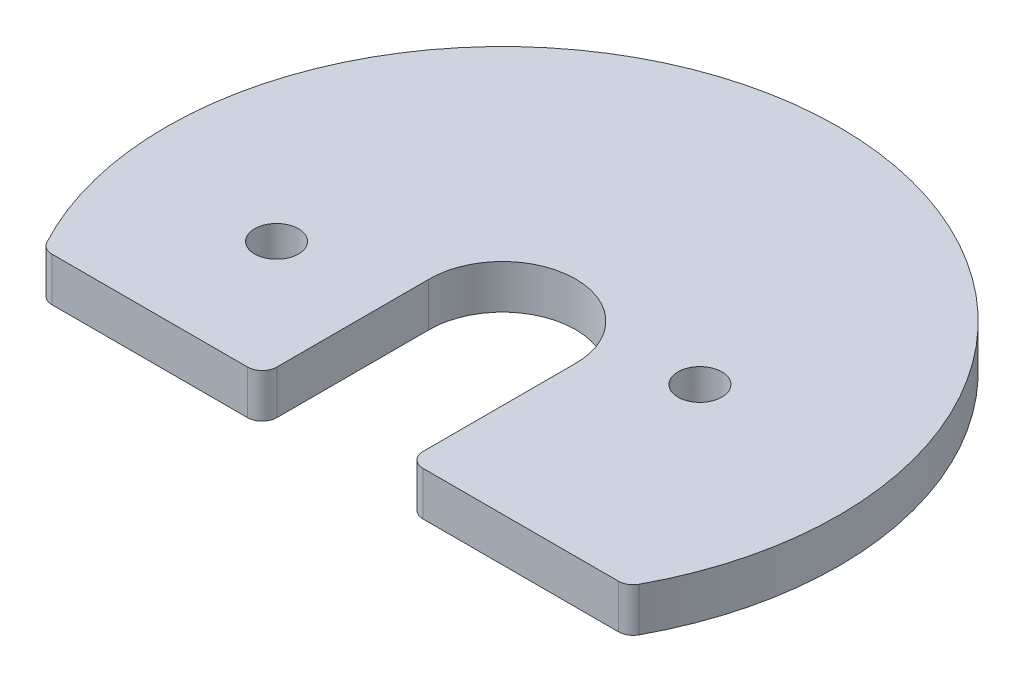
ISO-10303-21;
HEADER;
FILE_DESCRIPTION(('STEP AP214'),'2;1');
FILE_NAME('part.step','',(''),(''),'','','');
FILE_SCHEMA(('AUTOMOTIVE_DESIGN { 1 0 10303 214 1 1 1 1 }'));
ENDSEC;
DATA;
#1=APPLICATION_CONTEXT('core data for automotive mechanical design processes');
#2=APPLICATION_PROTOCOL_DEFINITION('international standard','automotive_design',2000,#1);
#3=PRODUCT_CONTEXT('',#1,'mechanical');
#4=PRODUCT('Part','Part','',(#3));
#5=PRODUCT_RELATED_PRODUCT_CATEGORY('part','',(#4));
#6=PRODUCT_DEFINITION_FORMATION('','',#4);
#7=PRODUCT_DEFINITION_CONTEXT('part definition',#1,'design');
#8=PRODUCT_DEFINITION('design','',#6,#7);
#9=PRODUCT_DEFINITION_SHAPE('','',#8);
#10=(LENGTH_UNIT() NAMED_UNIT(*) SI_UNIT(.MILLI.,.METRE.));
#11=(NAMED_UNIT(*) PLANE_ANGLE_UNIT() SI_UNIT($,.RADIAN.));
#12=(NAMED_UNIT(*) SI_UNIT($,.STERADIAN.) SOLID_ANGLE_UNIT());
#13=UNCERTAINTY_MEASURE_WITH_UNIT(LENGTH_MEASURE(1.E-05),#10,'distance_accuracy_value','');
#14=(GEOMETRIC_REPRESENTATION_CONTEXT(3) GLOBAL_UNCERTAINTY_ASSIGNED_CONTEXT((#13)) GLOBAL_UNIT_ASSIGNED_CONTEXT((#10,
#11,#12)) REPRESENTATION_CONTEXT('',''));
#15=CARTESIAN_POINT('',(0.,0.,0.));
#16=DIRECTION('',(0.,0.,1.));
#17=DIRECTION('',(1.,0.,0.));
#18=AXIS2_PLACEMENT_3D('',#15,#16,#17);
#19=CARTESIAN_POINT('',(0.,3.,0.));
#20=DIRECTION('',(0.,-1.,0.));
#21=DIRECTION('',(0.,0.,-1.));
#22=AXIS2_PLACEMENT_3D('',#19,#20,#21);
#23=CYLINDRICAL_SURFACE('',#22,23.);
#24=CARTESIAN_POINT('',(0.,3.,0.));
#25=DIRECTION('',(0.,1.,0.));
#26=DIRECTION('',(0.,0.,1.));
#27=AXIS2_PLACEMENT_3D('',#24,#25,#26);
#28=CIRCLE('',#27,23.);
#29=CARTESIAN_POINT('',(20.2495448022672,3.,10.906692225463));
#30=VERTEX_POINT('',#29);
#31=CARTESIAN_POINT('',(-20.2495448022671,3.,10.906692225463));
#32=VERTEX_POINT('',#31);
#33=EDGE_CURVE('E134',#30,#32,#28,.T.);
#34=ORIENTED_EDGE('',*,*,#33,.F.);
#35=DIRECTION('',(0.,-1.,0.));
#36=VECTOR('',#35,1.);
#37=CARTESIAN_POINT('',(20.2495448022672,3.,10.906692225463));
#38=LINE('',#37,#36);
#39=CARTESIAN_POINT('',(20.2495448022672,0.,10.906692225463));
#40=VERTEX_POINT('',#39);
#41=EDGE_CURVE('E195',#30,#40,#38,.T.);
#42=ORIENTED_EDGE('',*,*,#41,.T.);
#43=CARTESIAN_POINT('',(0.,0.,0.));
#44=DIRECTION('',(0.,1.,0.));
#45=DIRECTION('',(0.,0.,1.));
#46=AXIS2_PLACEMENT_3D('',#43,#44,#45);
#47=CIRCLE('',#46,23.);
#48=CARTESIAN_POINT('',(-20.2495448022671,0.,10.906692225463));
#49=VERTEX_POINT('',#48);
#50=EDGE_CURVE('E174',#40,#49,#47,.T.);
#51=ORIENTED_EDGE('',*,*,#50,.T.);
#52=DIRECTION('',(0.,-1.,0.));
#53=VECTOR('',#52,1.);
#54=CARTESIAN_POINT('',(-20.2495448022672,3.,10.906692225463));
#55=LINE('',#54,#53);
#56=EDGE_CURVE('E191',#49,#32,#55,.F.);
#57=ORIENTED_EDGE('',*,*,#56,.T.);
#58=EDGE_LOOP('',(#34,#42,#51,#57));
#59=FACE_BOUND('',#58,.T.);
#60=ADVANCED_FACE('F36',(#59),#23,.T.);
#61=CARTESIAN_POINT('',(0.,3.,0.));
#62=DIRECTION('',(0.,1.,0.));
#63=DIRECTION('',(0.,0.,1.));
#64=AXIS2_PLACEMENT_3D('',#61,#62,#63);
#65=PLANE('',#64);
#66=DIRECTION('',(-1.,0.,0.));
#67=VECTOR('',#66,1.);
#68=CARTESIAN_POINT('',(4.99954210615902,3.,11.4324882156603));
#69=LINE('',#68,#67);
#70=CARTESIAN_POINT('',(19.3691298108642,3.,11.4324882156603));
#71=VERTEX_POINT('',#70);
#72=CARTESIAN_POINT('',(5.99954210615902,3.,11.4324882156603));
#73=VERTEX_POINT('',#72);
#74=EDGE_CURVE('E145',#71,#73,#69,.T.);
#75=ORIENTED_EDGE('',*,*,#74,.F.);
#76=CARTESIAN_POINT('',(19.3691298108642,3.,10.4324882156603));
#77=DIRECTION('',(0.,1.,0.));
#78=DIRECTION('',(0.,0.,1.));
#79=AXIS2_PLACEMENT_3D('',#76,#77,#78);
#80=CIRCLE('',#79,1.);
#81=EDGE_CURVE('E223',#71,#30,#80,.T.);
#82=ORIENTED_EDGE('',*,*,#81,.T.);
#83=ORIENTED_EDGE('',*,*,#33,.T.);
#84=CARTESIAN_POINT('',(-19.3691298108642,3.,10.4324882156603));
#85=DIRECTION('',(0.,1.,0.));
#86=DIRECTION('',(0.,0.,1.));
#87=AXIS2_PLACEMENT_3D('',#84,#85,#86);
#88=CIRCLE('',#87,1.);
#89=CARTESIAN_POINT('',(-19.3691298108642,3.,11.4324882156603));
#90=VERTEX_POINT('',#89);
#91=EDGE_CURVE('E58',#32,#90,#88,.T.);
#92=ORIENTED_EDGE('',*,*,#91,.T.);
#93=DIRECTION('',(-1.,0.,0.));
#94=VECTOR('',#93,1.);
#95=CARTESIAN_POINT('',(-4.99954210615902,3.,11.4324882156603));
#96=LINE('',#95,#94);
#97=CARTESIAN_POINT('',(-5.99954210615902,3.,11.4324882156603));
#98=VERTEX_POINT('',#97);
#99=EDGE_CURVE('E140',#98,#90,#96,.T.);
#100=ORIENTED_EDGE('',*,*,#99,.F.);
#101=CARTESIAN_POINT('',(-5.99954210615902,3.,10.4324882156603));
#102=DIRECTION('',(0.,1.,0.));
#103=DIRECTION('',(0.,0.,1.));
#104=AXIS2_PLACEMENT_3D('',#101,#102,#103);
#105=CIRCLE('',#104,1.);
#106=CARTESIAN_POINT('',(-4.99954210615902,3.,10.4324882156603));
#107=VERTEX_POINT('',#106);
#108=EDGE_CURVE('E52',#98,#107,#105,.T.);
#109=ORIENTED_EDGE('',*,*,#108,.T.);
#110=DIRECTION('',(0.,0.,1.));
#111=VECTOR('',#110,1.);
#112=CARTESIAN_POINT('',(-4.99954210615902,3.,11.4324882156603));
#113=LINE('',#112,#111);
#114=CARTESIAN_POINT('',(-4.99954210615903,3.,0.0676663043394062));
#115=VERTEX_POINT('',#114);
#116=EDGE_CURVE('E129',#115,#107,#113,.T.);
#117=ORIENTED_EDGE('',*,*,#116,.F.);
#118=CARTESIAN_POINT('',(0.,3.,0.));
#119=DIRECTION('',(0.,1.,0.));
#120=DIRECTION('',(0.,0.,1.));
#121=AXIS2_PLACEMENT_3D('',#118,#119,#120);
#122=CIRCLE('',#121,5.);
#123=CARTESIAN_POINT('',(4.99954210615902,3.,0.0676663043396541));
#124=VERTEX_POINT('',#123);
#125=EDGE_CURVE('E114',#124,#115,#122,.T.);
#126=ORIENTED_EDGE('',*,*,#125,.F.);
#127=DIRECTION('',(0.,0.,-1.));
#128=VECTOR('',#127,1.);
#129=CARTESIAN_POINT('',(4.99954210615902,3.,11.4324882156603));
#130=LINE('',#129,#128);
#131=CARTESIAN_POINT('',(4.99954210615902,3.,10.4324882156603));
#132=VERTEX_POINT('',#131);
#133=EDGE_CURVE('E151',#132,#124,#130,.T.);
#134=ORIENTED_EDGE('',*,*,#133,.F.);
#135=CARTESIAN_POINT('',(5.99954210615902,3.,10.4324882156603));
#136=DIRECTION('',(0.,1.,0.));
#137=DIRECTION('',(0.,0.,1.));
#138=AXIS2_PLACEMENT_3D('',#135,#136,#137);
#139=CIRCLE('',#138,1.);
#140=EDGE_CURVE('E219',#132,#73,#139,.T.);
#141=ORIENTED_EDGE('',*,*,#140,.T.);
#142=EDGE_LOOP('',(#75,#82,#83,#92,#100,#109,#117,#126,#134,#141));
#143=FACE_BOUND('',#142,.T.);
#144=CARTESIAN_POINT('',(-12.4500000000001,3.,3.00000000000022));
#145=DIRECTION('',(0.,1.,0.));
#146=DIRECTION('',(0.,0.,1.));
#147=AXIS2_PLACEMENT_3D('',#144,#145,#146);
#148=CIRCLE('',#147,1.50000000000002);
#149=CARTESIAN_POINT('',(-12.4500000000001,3.,4.50000000000024));
#150=VERTEX_POINT('',#149);
#151=EDGE_CURVE('E170',#150,#150,#148,.T.);
#152=ORIENTED_EDGE('',*,*,#151,.F.);
#153=EDGE_LOOP('',(#152));
#154=FACE_BOUND('',#153,.T.);
#155=CARTESIAN_POINT('',(10.5000000000072,3.,-2.99999999999923));
#156=DIRECTION('',(0.,1.,0.));
#157=DIRECTION('',(0.,0.,1.));
#158=AXIS2_PLACEMENT_3D('',#155,#156,#157);
#159=CIRCLE('',#158,1.50000000000013);
#160=CARTESIAN_POINT('',(10.5000000000072,3.,-1.4999999999991));
#161=VERTEX_POINT('',#160);
#162=EDGE_CURVE('E162',#161,#161,#159,.T.);
#163=ORIENTED_EDGE('',*,*,#162,.F.);
#164=EDGE_LOOP('',(#163));
#165=FACE_BOUND('',#164,.T.);
#166=ADVANCED_FACE('F137',(#143,#154,#165),#65,.T.);
#167=CARTESIAN_POINT('',(0.,0.,0.));
#168=DIRECTION('',(0.,1.,0.));
#169=DIRECTION('',(0.,0.,1.));
#170=AXIS2_PLACEMENT_3D('',#167,#168,#169);
#171=PLANE('',#170);
#172=ORIENTED_EDGE('',*,*,#50,.F.);
#173=CARTESIAN_POINT('',(19.3691298108642,0.,10.4324882156603));
#174=DIRECTION('',(0.,1.,0.));
#175=DIRECTION('',(0.,0.,1.));
#176=AXIS2_PLACEMENT_3D('',#173,#174,#175);
#177=CIRCLE('',#176,1.);
#178=CARTESIAN_POINT('',(19.3691298108642,0.,11.4324882156603));
#179=VERTEX_POINT('',#178);
#180=EDGE_CURVE('E208',#40,#179,#177,.F.);
#181=ORIENTED_EDGE('',*,*,#180,.T.);
#182=DIRECTION('',(-1.,0.,0.));
#183=VECTOR('',#182,1.);
#184=CARTESIAN_POINT('',(0.,0.,11.4324882156603));
#185=LINE('',#184,#183);
#186=CARTESIAN_POINT('',(5.99954210615902,0.,11.4324882156603));
#187=VERTEX_POINT('',#186);
#188=EDGE_CURVE('E187',#179,#187,#185,.T.);
#189=ORIENTED_EDGE('',*,*,#188,.T.);
#190=CARTESIAN_POINT('',(5.99954210615902,0.,10.4324882156603));
#191=DIRECTION('',(0.,1.,0.));
#192=DIRECTION('',(0.,0.,1.));
#193=AXIS2_PLACEMENT_3D('',#190,#191,#192);
#194=CIRCLE('',#193,1.);
#195=CARTESIAN_POINT('',(4.99954210615902,0.,10.4324882156603));
#196=VERTEX_POINT('',#195);
#197=EDGE_CURVE('E202',#187,#196,#194,.F.);
#198=ORIENTED_EDGE('',*,*,#197,.T.);
#199=DIRECTION('',(0.,0.,-1.));
#200=VECTOR('',#199,1.);
#201=CARTESIAN_POINT('',(4.99954210615902,0.,0.));
#202=LINE('',#201,#200);
#203=CARTESIAN_POINT('',(4.99954210615902,0.,0.0676663043396541));
#204=VERTEX_POINT('',#203);
#205=EDGE_CURVE('E124',#196,#204,#202,.T.);
#206=ORIENTED_EDGE('',*,*,#205,.T.);
#207=CARTESIAN_POINT('',(0.,0.,0.));
#208=DIRECTION('',(0.,1.,0.));
#209=DIRECTION('',(0.,0.,1.));
#210=AXIS2_PLACEMENT_3D('',#207,#208,#209);
#211=CIRCLE('',#210,5.);
#212=CARTESIAN_POINT('',(-4.99954210615903,0.,0.0676663043394062));
#213=VERTEX_POINT('',#212);
#214=EDGE_CURVE('E123',#204,#213,#211,.T.);
#215=ORIENTED_EDGE('',*,*,#214,.T.);
#216=DIRECTION('',(0.,0.,1.));
#217=VECTOR('',#216,1.);
#218=CARTESIAN_POINT('',(-4.99954210615903,0.,0.));
#219=LINE('',#218,#217);
#220=CARTESIAN_POINT('',(-4.99954210615902,0.,10.4324882156603));
#221=VERTEX_POINT('',#220);
#222=EDGE_CURVE('E132',#213,#221,#219,.T.);
#223=ORIENTED_EDGE('',*,*,#222,.T.);
#224=CARTESIAN_POINT('',(-5.99954210615902,0.,10.4324882156603));
#225=DIRECTION('',(0.,1.,0.));
#226=DIRECTION('',(0.,0.,1.));
#227=AXIS2_PLACEMENT_3D('',#224,#225,#226);
#228=CIRCLE('',#227,1.);
#229=CARTESIAN_POINT('',(-5.99954210615902,0.,11.4324882156603));
#230=VERTEX_POINT('',#229);
#231=EDGE_CURVE('E199',#221,#230,#228,.F.);
#232=ORIENTED_EDGE('',*,*,#231,.T.);
#233=DIRECTION('',(-1.,0.,0.));
#234=VECTOR('',#233,1.);
#235=CARTESIAN_POINT('',(0.,0.,11.4324882156603));
#236=LINE('',#235,#234);
#237=CARTESIAN_POINT('',(-19.3691298108642,0.,11.4324882156603));
#238=VERTEX_POINT('',#237);
#239=EDGE_CURVE('E184',#230,#238,#236,.T.);
#240=ORIENTED_EDGE('',*,*,#239,.T.);
#241=CARTESIAN_POINT('',(-19.3691298108642,0.,10.4324882156603));
#242=DIRECTION('',(0.,1.,0.));
#243=DIRECTION('',(0.,0.,1.));
#244=AXIS2_PLACEMENT_3D('',#241,#242,#243);
#245=CIRCLE('',#244,1.);
#246=EDGE_CURVE('E205',#238,#49,#245,.F.);
#247=ORIENTED_EDGE('',*,*,#246,.T.);
#248=EDGE_LOOP('',(#172,#181,#189,#198,#206,#215,#223,#232,#240,#247));
#249=FACE_BOUND('',#248,.T.);
#250=CARTESIAN_POINT('',(-12.4500000000001,0.,3.00000000000022));
#251=DIRECTION('',(0.,-1.,0.));
#252=DIRECTION('',(0.,0.,-1.));
#253=AXIS2_PLACEMENT_3D('',#250,#251,#252);
#254=CIRCLE('',#253,1.50000000000002);
#255=CARTESIAN_POINT('',(-12.4500000000001,0.,1.50000000000021));
#256=VERTEX_POINT('',#255);
#257=EDGE_CURVE('E158',#256,#256,#254,.T.);
#258=ORIENTED_EDGE('',*,*,#257,.F.);
#259=EDGE_LOOP('',(#258));
#260=FACE_BOUND('',#259,.T.);
#261=CARTESIAN_POINT('',(10.5000000000072,0.,-2.99999999999923));
#262=DIRECTION('',(0.,-1.,0.));
#263=DIRECTION('',(0.,0.,-1.));
#264=AXIS2_PLACEMENT_3D('',#261,#262,#263);
#265=CIRCLE('',#264,1.50000000000013);
#266=CARTESIAN_POINT('',(10.5000000000072,0.,-4.49999999999935));
#267=VERTEX_POINT('',#266);
#268=EDGE_CURVE('E163',#267,#267,#265,.T.);
#269=ORIENTED_EDGE('',*,*,#268,.F.);
#270=EDGE_LOOP('',(#269));
#271=FACE_BOUND('',#270,.T.);
#272=ADVANCED_FACE('F249',(#249,#260,#271),#171,.F.);
#273=CARTESIAN_POINT('',(10.5000000000072,10.,-2.99999999999923));
#274=DIRECTION('',(0.,-1.,0.));
#275=DIRECTION('',(0.,0.,-1.));
#276=AXIS2_PLACEMENT_3D('',#273,#274,#275);
#277=CYLINDRICAL_SURFACE('',#276,1.50000000000013);
#278=ORIENTED_EDGE('',*,*,#162,.T.);
#279=EDGE_LOOP('',(#278));
#280=FACE_BOUND('',#279,.T.);
#281=ORIENTED_EDGE('',*,*,#268,.T.);
#282=EDGE_LOOP('',(#281));
#283=FACE_BOUND('',#282,.T.);
#284=ADVANCED_FACE('F351',(#280,#283),#277,.F.);
#285=CARTESIAN_POINT('',(-12.4500000000001,10.,3.00000000000022));
#286=DIRECTION('',(0.,-1.,0.));
#287=DIRECTION('',(0.,0.,-1.));
#288=AXIS2_PLACEMENT_3D('',#285,#286,#287);
#289=CYLINDRICAL_SURFACE('',#288,1.50000000000002);
#290=ORIENTED_EDGE('',*,*,#151,.T.);
#291=EDGE_LOOP('',(#290));
#292=FACE_BOUND('',#291,.T.);
#293=ORIENTED_EDGE('',*,*,#257,.T.);
#294=EDGE_LOOP('',(#293));
#295=FACE_BOUND('',#294,.T.);
#296=ADVANCED_FACE('F370',(#292,#295),#289,.F.);
#297=CARTESIAN_POINT('',(0.,-7.,0.));
#298=DIRECTION('',(0.,1.,0.));
#299=DIRECTION('',(0.,0.,1.));
#300=AXIS2_PLACEMENT_3D('',#297,#298,#299);
#301=CYLINDRICAL_SURFACE('',#300,5.);
#302=ORIENTED_EDGE('',*,*,#125,.T.);
#303=DIRECTION('',(0.,1.,0.));
#304=VECTOR('',#303,1.);
#305=CARTESIAN_POINT('',(-4.99954210615903,-7.,0.0676663043394062));
#306=LINE('',#305,#304);
#307=EDGE_CURVE('E118',#115,#213,#306,.F.);
#308=ORIENTED_EDGE('',*,*,#307,.T.);
#309=ORIENTED_EDGE('',*,*,#214,.F.);
#310=DIRECTION('',(0.,1.,0.));
#311=VECTOR('',#310,1.);
#312=CARTESIAN_POINT('',(4.99954210615902,-7.,0.0676663043396541));
#313=LINE('',#312,#311);
#314=EDGE_CURVE('E120',#204,#124,#313,.T.);
#315=ORIENTED_EDGE('',*,*,#314,.T.);
#316=EDGE_LOOP('',(#302,#308,#309,#315));
#317=FACE_BOUND('',#316,.T.);
#318=ADVANCED_FACE('F116',(#317),#301,.F.);
#319=CARTESIAN_POINT('',(-4.99954210615902,-7.,11.4324882156603));
#320=DIRECTION('',(-1.,0.,0.));
#321=DIRECTION('',(0.,0.,1.));
#322=AXIS2_PLACEMENT_3D('',#319,#320,#321);
#323=PLANE('',#322);
#324=ORIENTED_EDGE('',*,*,#116,.T.);
#325=DIRECTION('',(0.,1.,0.));
#326=VECTOR('',#325,1.);
#327=CARTESIAN_POINT('',(-4.99954210615902,-7.,10.4324882156603));
#328=LINE('',#327,#326);
#329=EDGE_CURVE('E11',#107,#221,#328,.F.);
#330=ORIENTED_EDGE('',*,*,#329,.T.);
#331=ORIENTED_EDGE('',*,*,#222,.F.);
#332=ORIENTED_EDGE('',*,*,#307,.F.);
#333=EDGE_LOOP('',(#324,#330,#331,#332));
#334=FACE_BOUND('',#333,.T.);
#335=ADVANCED_FACE('F128',(#334),#323,.F.);
#336=CARTESIAN_POINT('',(-4.99954210615902,-7.,11.4324882156603));
#337=DIRECTION('',(0.,0.,-1.));
#338=DIRECTION('',(-1.,0.,0.));
#339=AXIS2_PLACEMENT_3D('',#336,#337,#338);
#340=PLANE('',#339);
#341=ORIENTED_EDGE('',*,*,#99,.T.);
#342=DIRECTION('',(0.,-1.,0.));
#343=VECTOR('',#342,1.);
#344=CARTESIAN_POINT('',(-19.3691298108642,-7.,11.4324882156603));
#345=LINE('',#344,#343);
#346=EDGE_CURVE('E230',#90,#238,#345,.T.);
#347=ORIENTED_EDGE('',*,*,#346,.T.);
#348=ORIENTED_EDGE('',*,*,#239,.F.);
#349=DIRECTION('',(0.,1.,0.));
#350=VECTOR('',#349,1.);
#351=CARTESIAN_POINT('',(-5.99954210615902,-7.,11.4324882156603));
#352=LINE('',#351,#350);
#353=EDGE_CURVE('E226',#230,#98,#352,.T.);
#354=ORIENTED_EDGE('',*,*,#353,.T.);
#355=EDGE_LOOP('',(#341,#347,#348,#354));
#356=FACE_BOUND('',#355,.T.);
#357=ADVANCED_FACE('F263',(#356),#340,.F.);
#358=CARTESIAN_POINT('',(4.99954210615902,-7.,11.4324882156603));
#359=DIRECTION('',(0.,0.,-1.));
#360=DIRECTION('',(-1.,0.,0.));
#361=AXIS2_PLACEMENT_3D('',#358,#359,#360);
#362=PLANE('',#361);
#363=ORIENTED_EDGE('',*,*,#188,.F.);
#364=DIRECTION('',(0.,-1.,0.));
#365=VECTOR('',#364,1.);
#366=CARTESIAN_POINT('',(19.3691298108642,-7.,11.4324882156603));
#367=LINE('',#366,#365);
#368=EDGE_CURVE('E214',#179,#71,#367,.F.);
#369=ORIENTED_EDGE('',*,*,#368,.T.);
#370=ORIENTED_EDGE('',*,*,#74,.T.);
#371=DIRECTION('',(0.,1.,0.));
#372=VECTOR('',#371,1.);
#373=CARTESIAN_POINT('',(5.99954210615902,-7.,11.4324882156603));
#374=LINE('',#373,#372);
#375=EDGE_CURVE('E211',#73,#187,#374,.F.);
#376=ORIENTED_EDGE('',*,*,#375,.T.);
#377=EDGE_LOOP('',(#363,#369,#370,#376));
#378=FACE_BOUND('',#377,.T.);
#379=ADVANCED_FACE('F244',(#378),#362,.F.);
#380=CARTESIAN_POINT('',(4.99954210615902,-7.,11.4324882156603));
#381=DIRECTION('',(1.,0.,0.));
#382=DIRECTION('',(0.,0.,-1.));
#383=AXIS2_PLACEMENT_3D('',#380,#381,#382);
#384=PLANE('',#383);
#385=ORIENTED_EDGE('',*,*,#205,.F.);
#386=DIRECTION('',(0.,1.,0.));
#387=VECTOR('',#386,1.);
#388=CARTESIAN_POINT('',(4.99954210615902,-7.,10.4324882156603));
#389=LINE('',#388,#387);
#390=EDGE_CURVE('E45',#196,#132,#389,.T.);
#391=ORIENTED_EDGE('',*,*,#390,.T.);
#392=ORIENTED_EDGE('',*,*,#133,.T.);
#393=ORIENTED_EDGE('',*,*,#314,.F.);
#394=EDGE_LOOP('',(#385,#391,#392,#393));
#395=FACE_BOUND('',#394,.T.);
#396=ADVANCED_FACE('F237',(#395),#384,.F.);
#397=CARTESIAN_POINT('',(19.3691298108642,3.,10.4324882156603));
#398=DIRECTION('',(0.,-1.,0.));
#399=DIRECTION('',(0.,0.,-1.));
#400=AXIS2_PLACEMENT_3D('',#397,#398,#399);
#401=CYLINDRICAL_SURFACE('',#400,1.);
#402=ORIENTED_EDGE('',*,*,#81,.F.);
#403=ORIENTED_EDGE('',*,*,#368,.F.);
#404=ORIENTED_EDGE('',*,*,#180,.F.);
#405=ORIENTED_EDGE('',*,*,#41,.F.);
#406=EDGE_LOOP('',(#402,#403,#404,#405));
#407=FACE_BOUND('',#406,.T.);
#408=ADVANCED_FACE('F252',(#407),#401,.T.);
#409=CARTESIAN_POINT('',(-19.3691298108642,3.,10.4324882156603));
#410=DIRECTION('',(0.,-1.,0.));
#411=DIRECTION('',(0.,0.,-1.));
#412=AXIS2_PLACEMENT_3D('',#409,#410,#411);
#413=CYLINDRICAL_SURFACE('',#412,1.);
#414=ORIENTED_EDGE('',*,*,#246,.F.);
#415=ORIENTED_EDGE('',*,*,#346,.F.);
#416=ORIENTED_EDGE('',*,*,#91,.F.);
#417=ORIENTED_EDGE('',*,*,#56,.F.);
#418=EDGE_LOOP('',(#414,#415,#416,#417));
#419=FACE_BOUND('',#418,.T.);
#420=ADVANCED_FACE('F259',(#419),#413,.T.);
#421=CARTESIAN_POINT('',(5.99954210615902,-7.,10.4324882156603));
#422=DIRECTION('',(0.,1.,0.));
#423=DIRECTION('',(0.,0.,1.));
#424=AXIS2_PLACEMENT_3D('',#421,#422,#423);
#425=CYLINDRICAL_SURFACE('',#424,1.);
#426=ORIENTED_EDGE('',*,*,#197,.F.);
#427=ORIENTED_EDGE('',*,*,#375,.F.);
#428=ORIENTED_EDGE('',*,*,#140,.F.);
#429=ORIENTED_EDGE('',*,*,#390,.F.);
#430=EDGE_LOOP('',(#426,#427,#428,#429));
#431=FACE_BOUND('',#430,.T.);
#432=ADVANCED_FACE('F246',(#431),#425,.T.);
#433=CARTESIAN_POINT('',(-5.99954210615902,-7.,10.4324882156603));
#434=DIRECTION('',(0.,1.,0.));
#435=DIRECTION('',(0.,0.,1.));
#436=AXIS2_PLACEMENT_3D('',#433,#434,#435);
#437=CYLINDRICAL_SURFACE('',#436,1.);
#438=ORIENTED_EDGE('',*,*,#231,.F.);
#439=ORIENTED_EDGE('',*,*,#329,.F.);
#440=ORIENTED_EDGE('',*,*,#108,.F.);
#441=ORIENTED_EDGE('',*,*,#353,.F.);
#442=EDGE_LOOP('',(#438,#439,#440,#441));
#443=FACE_BOUND('',#442,.T.);
#444=ADVANCED_FACE('F38',(#443),#437,.T.);
#445=CLOSED_SHELL('',(#60,#166,#272,#284,#296,#318,#335,#357,#379,#396,#408,#420,#432,#444));
#446=MANIFOLD_SOLID_BREP('B2',#445);
#447=ADVANCED_BREP_SHAPE_REPRESENTATION('',(#18,#446),#14);
#448=SHAPE_DEFINITION_REPRESENTATION(#9,#447);
ENDSEC;
END-ISO-10303-21;
